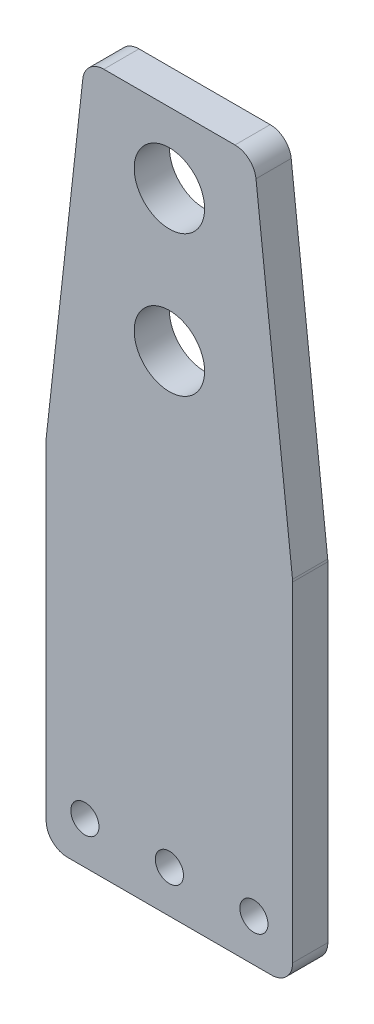
ISO-10303-21;
HEADER;
FILE_DESCRIPTION(('STEP AP214'),'2;1');
FILE_NAME('part.step','',(''),(''),'','','');
FILE_SCHEMA(('AUTOMOTIVE_DESIGN { 1 0 10303 214 1 1 1 1 }'));
ENDSEC;
DATA;
#1=APPLICATION_CONTEXT('core data for automotive mechanical design processes');
#2=APPLICATION_PROTOCOL_DEFINITION('international standard','automotive_design',2000,#1);
#3=PRODUCT_CONTEXT('',#1,'mechanical');
#4=PRODUCT('Part','Part','',(#3));
#5=PRODUCT_RELATED_PRODUCT_CATEGORY('part','',(#4));
#6=PRODUCT_DEFINITION_FORMATION('','',#4);
#7=PRODUCT_DEFINITION_CONTEXT('part definition',#1,'design');
#8=PRODUCT_DEFINITION('design','',#6,#7);
#9=PRODUCT_DEFINITION_SHAPE('','',#8);
#10=(LENGTH_UNIT() NAMED_UNIT(*) SI_UNIT(.MILLI.,.METRE.));
#11=(NAMED_UNIT(*) PLANE_ANGLE_UNIT() SI_UNIT($,.RADIAN.));
#12=(NAMED_UNIT(*) SI_UNIT($,.STERADIAN.) SOLID_ANGLE_UNIT());
#13=UNCERTAINTY_MEASURE_WITH_UNIT(LENGTH_MEASURE(1.E-05),#10,'distance_accuracy_value','');
#14=(GEOMETRIC_REPRESENTATION_CONTEXT(3) GLOBAL_UNCERTAINTY_ASSIGNED_CONTEXT((#13)) GLOBAL_UNIT_ASSIGNED_CONTEXT((#10,
#11,#12)) REPRESENTATION_CONTEXT('',''));
#15=CARTESIAN_POINT('',(0.,0.,0.));
#16=DIRECTION('',(0.,0.,1.));
#17=DIRECTION('',(1.,0.,0.));
#18=AXIS2_PLACEMENT_3D('',#15,#16,#17);
#19=CARTESIAN_POINT('',(-35.,50.,5.));
#20=DIRECTION('',(1.,0.,0.));
#21=DIRECTION('',(0.,0.,-1.));
#22=AXIS2_PLACEMENT_3D('',#19,#20,#21);
#23=PLANE('',#22);
#24=DIRECTION('',(0.,-1.,0.));
#25=VECTOR('',#24,1.);
#26=CARTESIAN_POINT('',(-35.,50.,0.));
#27=LINE('',#26,#25);
#28=CARTESIAN_POINT('',(-35.,49.8338445855878,0.));
#29=VERTEX_POINT('',#28);
#30=CARTESIAN_POINT('',(-35.,3.,0.));
#31=VERTEX_POINT('',#30);
#32=EDGE_CURVE('E171',#29,#31,#27,.T.);
#33=ORIENTED_EDGE('',*,*,#32,.T.);
#34=DIRECTION('',(0.,0.,-1.));
#35=VECTOR('',#34,1.);
#36=CARTESIAN_POINT('',(-35.,3.,5.));
#37=LINE('',#36,#35);
#38=CARTESIAN_POINT('',(-35.,3.,5.));
#39=VERTEX_POINT('',#38);
#40=EDGE_CURVE('E223',#31,#39,#37,.F.);
#41=ORIENTED_EDGE('',*,*,#40,.T.);
#42=DIRECTION('',(0.,-1.,0.));
#43=VECTOR('',#42,1.);
#44=CARTESIAN_POINT('',(-35.,50.,5.));
#45=LINE('',#44,#43);
#46=CARTESIAN_POINT('',(-35.,49.8338445855878,5.));
#47=VERTEX_POINT('',#46);
#48=EDGE_CURVE('E181',#47,#39,#45,.T.);
#49=ORIENTED_EDGE('',*,*,#48,.F.);
#50=DIRECTION('',(0.,0.,-1.));
#51=VECTOR('',#50,1.);
#52=CARTESIAN_POINT('',(-35.,49.8338445855878,5.));
#53=LINE('',#52,#51);
#54=EDGE_CURVE('E219',#47,#29,#53,.T.);
#55=ORIENTED_EDGE('',*,*,#54,.T.);
#56=EDGE_LOOP('',(#33,#41,#49,#55));
#57=FACE_BOUND('',#56,.T.);
#58=ADVANCED_FACE('F43',(#57),#23,.F.);
#59=CARTESIAN_POINT('',(-35.,0.,5.));
#60=DIRECTION('',(0.,1.,0.));
#61=DIRECTION('',(0.,0.,1.));
#62=AXIS2_PLACEMENT_3D('',#59,#60,#61);
#63=PLANE('',#62);
#64=DIRECTION('',(1.,0.,0.));
#65=VECTOR('',#64,1.);
#66=CARTESIAN_POINT('',(-35.,0.,0.));
#67=LINE('',#66,#65);
#68=CARTESIAN_POINT('',(-32.,0.,0.));
#69=VERTEX_POINT('',#68);
#70=CARTESIAN_POINT('',(-3.,0.,0.));
#71=VERTEX_POINT('',#70);
#72=EDGE_CURVE('E164',#69,#71,#67,.T.);
#73=ORIENTED_EDGE('',*,*,#72,.T.);
#74=DIRECTION('',(0.,0.,-1.));
#75=VECTOR('',#74,1.);
#76=CARTESIAN_POINT('',(-3.,0.,5.));
#77=LINE('',#76,#75);
#78=CARTESIAN_POINT('',(-3.,0.,5.));
#79=VERTEX_POINT('',#78);
#80=EDGE_CURVE('E138',#71,#79,#77,.F.);
#81=ORIENTED_EDGE('',*,*,#80,.T.);
#82=DIRECTION('',(1.,0.,0.));
#83=VECTOR('',#82,1.);
#84=CARTESIAN_POINT('',(-35.,0.,5.));
#85=LINE('',#84,#83);
#86=CARTESIAN_POINT('',(-32.,0.,5.));
#87=VERTEX_POINT('',#86);
#88=EDGE_CURVE('E258',#87,#79,#85,.T.);
#89=ORIENTED_EDGE('',*,*,#88,.F.);
#90=DIRECTION('',(0.,0.,-1.));
#91=VECTOR('',#90,1.);
#92=CARTESIAN_POINT('',(-32.,0.,5.));
#93=LINE('',#92,#91);
#94=EDGE_CURVE('E144',#87,#69,#93,.T.);
#95=ORIENTED_EDGE('',*,*,#94,.T.);
#96=EDGE_LOOP('',(#73,#81,#89,#95));
#97=FACE_BOUND('',#96,.T.);
#98=ADVANCED_FACE('F342',(#97),#63,.F.);
#99=CARTESIAN_POINT('',(0.,0.,5.));
#100=DIRECTION('',(-1.,0.,0.));
#101=DIRECTION('',(0.,0.,1.));
#102=AXIS2_PLACEMENT_3D('',#99,#100,#101);
#103=PLANE('',#102);
#104=DIRECTION('',(0.,1.,0.));
#105=VECTOR('',#104,1.);
#106=CARTESIAN_POINT('',(0.,0.,5.));
#107=LINE('',#106,#105);
#108=CARTESIAN_POINT('',(0.,3.,5.));
#109=VERTEX_POINT('',#108);
#110=CARTESIAN_POINT('',(0.,49.8338445855878,5.));
#111=VERTEX_POINT('',#110);
#112=EDGE_CURVE('E154',#109,#111,#107,.T.);
#113=ORIENTED_EDGE('',*,*,#112,.F.);
#114=DIRECTION('',(0.,0.,-1.));
#115=VECTOR('',#114,1.);
#116=CARTESIAN_POINT('',(0.,3.,5.));
#117=LINE('',#116,#115);
#118=CARTESIAN_POINT('',(0.,3.,0.));
#119=VERTEX_POINT('',#118);
#120=EDGE_CURVE('E137',#109,#119,#117,.T.);
#121=ORIENTED_EDGE('',*,*,#120,.T.);
#122=DIRECTION('',(0.,1.,0.));
#123=VECTOR('',#122,1.);
#124=CARTESIAN_POINT('',(0.,0.,0.));
#125=LINE('',#124,#123);
#126=CARTESIAN_POINT('',(0.,49.8338445855878,0.));
#127=VERTEX_POINT('',#126);
#128=EDGE_CURVE('E151',#119,#127,#125,.T.);
#129=ORIENTED_EDGE('',*,*,#128,.T.);
#130=DIRECTION('',(0.,0.,-1.));
#131=VECTOR('',#130,1.);
#132=CARTESIAN_POINT('',(0.,49.8338445855878,5.));
#133=LINE('',#132,#131);
#134=EDGE_CURVE('E157',#127,#111,#133,.F.);
#135=ORIENTED_EDGE('',*,*,#134,.T.);
#136=EDGE_LOOP('',(#113,#121,#129,#135));
#137=FACE_BOUND('',#136,.T.);
#138=ADVANCED_FACE('F150',(#137),#103,.F.);
#139=CARTESIAN_POINT('',(0.,50.,5.));
#140=DIRECTION('',(-0.993883734673619,-0.110431526074847,0.));
#141=DIRECTION('',(0.110431526074847,-0.993883734673619,0.));
#142=AXIS2_PLACEMENT_3D('',#139,#140,#141);
#143=PLANE('',#142);
#144=DIRECTION('',(-0.110431526074846,0.993883734673619,0.));
#145=VECTOR('',#144,1.);
#146=CARTESIAN_POINT('',(0.,50.,5.));
#147=LINE('',#146,#145);
#148=CARTESIAN_POINT('',(-0.0183487959791435,50.1651391638123,5.));
#149=VERTEX_POINT('',#148);
#150=CARTESIAN_POINT('',(-5.20347717535828,96.8312945782245,5.));
#151=VERTEX_POINT('',#150);
#152=EDGE_CURVE('E269',#149,#151,#147,.T.);
#153=ORIENTED_EDGE('',*,*,#152,.F.);
#154=DIRECTION('',(0.,0.,-1.));
#155=VECTOR('',#154,1.);
#156=CARTESIAN_POINT('',(-0.0183487959791435,50.1651391638123,5.));
#157=LINE('',#156,#155);
#158=CARTESIAN_POINT('',(-0.0183487959791435,50.1651391638123,0.));
#159=VERTEX_POINT('',#158);
#160=EDGE_CURVE('E229',#149,#159,#157,.T.);
#161=ORIENTED_EDGE('',*,*,#160,.T.);
#162=DIRECTION('',(-0.110431526074846,0.993883734673619,0.));
#163=VECTOR('',#162,1.);
#164=CARTESIAN_POINT('',(0.,50.,0.));
#165=LINE('',#164,#163);
#166=CARTESIAN_POINT('',(-5.20347717535828,96.8312945782245,0.));
#167=VERTEX_POINT('',#166);
#168=EDGE_CURVE('E163',#159,#167,#165,.T.);
#169=ORIENTED_EDGE('',*,*,#168,.T.);
#170=DIRECTION('',(0.,0.,-1.));
#171=VECTOR('',#170,1.);
#172=CARTESIAN_POINT('',(-5.20347717535828,96.8312945782245,5.));
#173=LINE('',#172,#171);
#174=EDGE_CURVE('E226',#167,#151,#173,.F.);
#175=ORIENTED_EDGE('',*,*,#174,.T.);
#176=EDGE_LOOP('',(#153,#161,#169,#175));
#177=FACE_BOUND('',#176,.T.);
#178=ADVANCED_FACE('F365',(#177),#143,.F.);
#179=CARTESIAN_POINT('',(-5.5,99.5,5.));
#180=DIRECTION('',(0.,-1.,0.));
#181=DIRECTION('',(0.,0.,-1.));
#182=AXIS2_PLACEMENT_3D('',#179,#180,#181);
#183=PLANE('',#182);
#184=DIRECTION('',(-1.,0.,0.));
#185=VECTOR('',#184,1.);
#186=CARTESIAN_POINT('',(-5.5,99.5,5.));
#187=LINE('',#186,#185);
#188=CARTESIAN_POINT('',(-8.18512837937914,99.5,5.));
#189=VERTEX_POINT('',#188);
#190=CARTESIAN_POINT('',(-26.8148716206209,99.5,5.));
#191=VERTEX_POINT('',#190);
#192=EDGE_CURVE('E273',#189,#191,#187,.T.);
#193=ORIENTED_EDGE('',*,*,#192,.F.);
#194=DIRECTION('',(0.,0.,-1.));
#195=VECTOR('',#194,1.);
#196=CARTESIAN_POINT('',(-8.18512837937914,99.5,5.));
#197=LINE('',#196,#195);
#198=CARTESIAN_POINT('',(-8.18512837937914,99.5,0.));
#199=VERTEX_POINT('',#198);
#200=EDGE_CURVE('E236',#189,#199,#197,.T.);
#201=ORIENTED_EDGE('',*,*,#200,.T.);
#202=DIRECTION('',(-1.,0.,0.));
#203=VECTOR('',#202,1.);
#204=CARTESIAN_POINT('',(-5.5,99.5,0.));
#205=LINE('',#204,#203);
#206=CARTESIAN_POINT('',(-26.8148716206209,99.5,0.));
#207=VERTEX_POINT('',#206);
#208=EDGE_CURVE('E169',#199,#207,#205,.T.);
#209=ORIENTED_EDGE('',*,*,#208,.T.);
#210=DIRECTION('',(0.,0.,-1.));
#211=VECTOR('',#210,1.);
#212=CARTESIAN_POINT('',(-26.8148716206209,99.5,5.));
#213=LINE('',#212,#211);
#214=EDGE_CURVE('E233',#207,#191,#213,.F.);
#215=ORIENTED_EDGE('',*,*,#214,.T.);
#216=EDGE_LOOP('',(#193,#201,#209,#215));
#217=FACE_BOUND('',#216,.T.);
#218=ADVANCED_FACE('F368',(#217),#183,.F.);
#219=CARTESIAN_POINT('',(-29.5,99.5,5.));
#220=DIRECTION('',(0.993883734673619,-0.110431526074847,0.));
#221=DIRECTION('',(0.110431526074847,0.993883734673619,0.));
#222=AXIS2_PLACEMENT_3D('',#219,#220,#221);
#223=PLANE('',#222);
#224=DIRECTION('',(-0.110431526074847,-0.993883734673619,0.));
#225=VECTOR('',#224,1.);
#226=CARTESIAN_POINT('',(-29.5,99.5,0.));
#227=LINE('',#226,#225);
#228=CARTESIAN_POINT('',(-29.7965228246417,96.8312945782245,0.));
#229=VERTEX_POINT('',#228);
#230=CARTESIAN_POINT('',(-34.9816512040209,50.1651391638123,0.));
#231=VERTEX_POINT('',#230);
#232=EDGE_CURVE('E178',#229,#231,#227,.T.);
#233=ORIENTED_EDGE('',*,*,#232,.T.);
#234=DIRECTION('',(0.,0.,-1.));
#235=VECTOR('',#234,1.);
#236=CARTESIAN_POINT('',(-34.9816512040209,50.1651391638123,5.));
#237=LINE('',#236,#235);
#238=CARTESIAN_POINT('',(-34.9816512040209,50.1651391638123,5.));
#239=VERTEX_POINT('',#238);
#240=EDGE_CURVE('E11',#231,#239,#237,.F.);
#241=ORIENTED_EDGE('',*,*,#240,.T.);
#242=DIRECTION('',(-0.110431526074847,-0.993883734673619,0.));
#243=VECTOR('',#242,1.);
#244=CARTESIAN_POINT('',(-29.5,99.5,5.));
#245=LINE('',#244,#243);
#246=CARTESIAN_POINT('',(-29.7965228246417,96.8312945782245,5.));
#247=VERTEX_POINT('',#246);
#248=EDGE_CURVE('E183',#247,#239,#245,.T.);
#249=ORIENTED_EDGE('',*,*,#248,.F.);
#250=DIRECTION('',(0.,0.,-1.));
#251=VECTOR('',#250,1.);
#252=CARTESIAN_POINT('',(-29.7965228246417,96.8312945782245,5.));
#253=LINE('',#252,#251);
#254=EDGE_CURVE('E52',#247,#229,#253,.T.);
#255=ORIENTED_EDGE('',*,*,#254,.T.);
#256=EDGE_LOOP('',(#233,#241,#249,#255));
#257=FACE_BOUND('',#256,.T.);
#258=ADVANCED_FACE('F243',(#257),#223,.F.);
#259=CARTESIAN_POINT('',(0.,0.,5.));
#260=DIRECTION('',(0.,0.,1.));
#261=DIRECTION('',(1.,0.,0.));
#262=AXIS2_PLACEMENT_3D('',#259,#260,#261);
#263=PLANE('',#262);
#264=CARTESIAN_POINT('',(-17.5,69.5,5.));
#265=DIRECTION('',(0.,0.,1.));
#266=DIRECTION('',(1.,0.,0.));
#267=AXIS2_PLACEMENT_3D('',#264,#265,#266);
#268=CIRCLE('',#267,4.99999999999999);
#269=CARTESIAN_POINT('',(-12.5,69.5,5.));
#270=VERTEX_POINT('',#269);
#271=EDGE_CURVE('E320',#270,#270,#268,.T.);
#272=ORIENTED_EDGE('',*,*,#271,.F.);
#273=EDGE_LOOP('',(#272));
#274=FACE_BOUND('',#273,.T.);
#275=CARTESIAN_POINT('',(-17.5,89.5,5.));
#276=DIRECTION('',(0.,0.,1.));
#277=DIRECTION('',(1.,0.,0.));
#278=AXIS2_PLACEMENT_3D('',#275,#276,#277);
#279=CIRCLE('',#278,4.99999999999999);
#280=CARTESIAN_POINT('',(-12.5,89.5,5.));
#281=VERTEX_POINT('',#280);
#282=EDGE_CURVE('E310',#281,#281,#279,.T.);
#283=ORIENTED_EDGE('',*,*,#282,.F.);
#284=EDGE_LOOP('',(#283));
#285=FACE_BOUND('',#284,.T.);
#286=CARTESIAN_POINT('',(-29.5,6.,5.));
#287=DIRECTION('',(0.,0.,1.));
#288=DIRECTION('',(1.,0.,0.));
#289=AXIS2_PLACEMENT_3D('',#286,#287,#288);
#290=CIRCLE('',#289,2.);
#291=CARTESIAN_POINT('',(-27.5,6.,5.));
#292=VERTEX_POINT('',#291);
#293=EDGE_CURVE('E281',#292,#292,#290,.T.);
#294=ORIENTED_EDGE('',*,*,#293,.F.);
#295=EDGE_LOOP('',(#294));
#296=FACE_BOUND('',#295,.T.);
#297=CARTESIAN_POINT('',(-17.5,6.,5.));
#298=DIRECTION('',(0.,0.,1.));
#299=DIRECTION('',(1.,0.,0.));
#300=AXIS2_PLACEMENT_3D('',#297,#298,#299);
#301=CIRCLE('',#300,2.);
#302=CARTESIAN_POINT('',(-15.5,6.,5.));
#303=VERTEX_POINT('',#302);
#304=EDGE_CURVE('E296',#303,#303,#301,.T.);
#305=ORIENTED_EDGE('',*,*,#304,.F.);
#306=EDGE_LOOP('',(#305));
#307=FACE_BOUND('',#306,.T.);
#308=CARTESIAN_POINT('',(-5.5,6.,5.));
#309=DIRECTION('',(0.,0.,1.));
#310=DIRECTION('',(1.,0.,0.));
#311=AXIS2_PLACEMENT_3D('',#308,#309,#310);
#312=CIRCLE('',#311,2.);
#313=CARTESIAN_POINT('',(-3.5,6.,5.));
#314=VERTEX_POINT('',#313);
#315=EDGE_CURVE('E264',#314,#314,#312,.T.);
#316=ORIENTED_EDGE('',*,*,#315,.F.);
#317=EDGE_LOOP('',(#316));
#318=FACE_BOUND('',#317,.T.);
#319=ORIENTED_EDGE('',*,*,#88,.T.);
#320=CARTESIAN_POINT('',(-3.,3.,5.));
#321=DIRECTION('',(0.,0.,1.));
#322=DIRECTION('',(1.,0.,0.));
#323=AXIS2_PLACEMENT_3D('',#320,#321,#322);
#324=CIRCLE('',#323,3.);
#325=EDGE_CURVE('E216',#79,#109,#324,.T.);
#326=ORIENTED_EDGE('',*,*,#325,.T.);
#327=ORIENTED_EDGE('',*,*,#112,.T.);
#328=CARTESIAN_POINT('',(-3.,49.8338445855878,5.));
#329=DIRECTION('',(0.,0.,1.));
#330=DIRECTION('',(1.,0.,0.));
#331=AXIS2_PLACEMENT_3D('',#328,#329,#330);
#332=CIRCLE('',#331,3.);
#333=EDGE_CURVE('E210',#111,#149,#332,.T.);
#334=ORIENTED_EDGE('',*,*,#333,.T.);
#335=ORIENTED_EDGE('',*,*,#152,.T.);
#336=CARTESIAN_POINT('',(-8.18512837937914,96.5,5.));
#337=DIRECTION('',(0.,0.,1.));
#338=DIRECTION('',(1.,0.,0.));
#339=AXIS2_PLACEMENT_3D('',#336,#337,#338);
#340=CIRCLE('',#339,3.);
#341=EDGE_CURVE('E207',#151,#189,#340,.T.);
#342=ORIENTED_EDGE('',*,*,#341,.T.);
#343=ORIENTED_EDGE('',*,*,#192,.T.);
#344=CARTESIAN_POINT('',(-26.8148716206209,96.5,5.));
#345=DIRECTION('',(0.,0.,1.));
#346=DIRECTION('',(1.,0.,0.));
#347=AXIS2_PLACEMENT_3D('',#344,#345,#346);
#348=CIRCLE('',#347,3.);
#349=EDGE_CURVE('E64',#191,#247,#348,.T.);
#350=ORIENTED_EDGE('',*,*,#349,.T.);
#351=ORIENTED_EDGE('',*,*,#248,.T.);
#352=CARTESIAN_POINT('',(-32.,49.8338445855878,5.));
#353=DIRECTION('',(0.,0.,1.));
#354=DIRECTION('',(1.,0.,0.));
#355=AXIS2_PLACEMENT_3D('',#352,#353,#354);
#356=CIRCLE('',#355,3.);
#357=EDGE_CURVE('E204',#239,#47,#356,.T.);
#358=ORIENTED_EDGE('',*,*,#357,.T.);
#359=ORIENTED_EDGE('',*,*,#48,.T.);
#360=CARTESIAN_POINT('',(-32.,3.,5.));
#361=DIRECTION('',(0.,0.,1.));
#362=DIRECTION('',(1.,0.,0.));
#363=AXIS2_PLACEMENT_3D('',#360,#361,#362);
#364=CIRCLE('',#363,3.);
#365=EDGE_CURVE('E213',#39,#87,#364,.T.);
#366=ORIENTED_EDGE('',*,*,#365,.T.);
#367=EDGE_LOOP('',(#319,#326,#327,#334,#335,#342,#343,#350,#351,#358,#359,#366));
#368=FACE_BOUND('',#367,.T.);
#369=ADVANCED_FACE('F330',(#274,#285,#296,#307,#318,#368),#263,.T.);
#370=CARTESIAN_POINT('',(0.,0.,0.));
#371=DIRECTION('',(0.,0.,1.));
#372=DIRECTION('',(1.,0.,0.));
#373=AXIS2_PLACEMENT_3D('',#370,#371,#372);
#374=PLANE('',#373);
#375=CARTESIAN_POINT('',(-17.5,69.5,0.));
#376=DIRECTION('',(0.,0.,1.));
#377=DIRECTION('',(1.,0.,0.));
#378=AXIS2_PLACEMENT_3D('',#375,#376,#377);
#379=CIRCLE('',#378,4.99999999999999);
#380=CARTESIAN_POINT('',(-12.5,69.5,0.));
#381=VERTEX_POINT('',#380);
#382=EDGE_CURVE('E315',#381,#381,#379,.T.);
#383=ORIENTED_EDGE('',*,*,#382,.T.);
#384=EDGE_LOOP('',(#383));
#385=FACE_BOUND('',#384,.T.);
#386=CARTESIAN_POINT('',(-17.5,89.5,0.));
#387=DIRECTION('',(0.,0.,1.));
#388=DIRECTION('',(1.,0.,0.));
#389=AXIS2_PLACEMENT_3D('',#386,#387,#388);
#390=CIRCLE('',#389,4.99999999999999);
#391=CARTESIAN_POINT('',(-12.5,89.5,0.));
#392=VERTEX_POINT('',#391);
#393=EDGE_CURVE('E290',#392,#392,#390,.T.);
#394=ORIENTED_EDGE('',*,*,#393,.T.);
#395=EDGE_LOOP('',(#394));
#396=FACE_BOUND('',#395,.T.);
#397=CARTESIAN_POINT('',(-29.5,6.,0.));
#398=DIRECTION('',(0.,0.,1.));
#399=DIRECTION('',(1.,0.,0.));
#400=AXIS2_PLACEMENT_3D('',#397,#398,#399);
#401=CIRCLE('',#400,2.);
#402=CARTESIAN_POINT('',(-27.5,6.,0.));
#403=VERTEX_POINT('',#402);
#404=EDGE_CURVE('E278',#403,#403,#401,.T.);
#405=ORIENTED_EDGE('',*,*,#404,.T.);
#406=EDGE_LOOP('',(#405));
#407=FACE_BOUND('',#406,.T.);
#408=CARTESIAN_POINT('',(-17.5,6.,0.));
#409=DIRECTION('',(0.,0.,1.));
#410=DIRECTION('',(1.,0.,0.));
#411=AXIS2_PLACEMENT_3D('',#408,#409,#410);
#412=CIRCLE('',#411,2.);
#413=CARTESIAN_POINT('',(-15.5,6.,0.));
#414=VERTEX_POINT('',#413);
#415=EDGE_CURVE('E287',#414,#414,#412,.T.);
#416=ORIENTED_EDGE('',*,*,#415,.T.);
#417=EDGE_LOOP('',(#416));
#418=FACE_BOUND('',#417,.T.);
#419=CARTESIAN_POINT('',(-5.5,6.,0.));
#420=DIRECTION('',(0.,0.,1.));
#421=DIRECTION('',(1.,0.,0.));
#422=AXIS2_PLACEMENT_3D('',#419,#420,#421);
#423=CIRCLE('',#422,2.);
#424=CARTESIAN_POINT('',(-3.5,6.,0.));
#425=VERTEX_POINT('',#424);
#426=EDGE_CURVE('E299',#425,#425,#423,.T.);
#427=ORIENTED_EDGE('',*,*,#426,.T.);
#428=EDGE_LOOP('',(#427));
#429=FACE_BOUND('',#428,.T.);
#430=ORIENTED_EDGE('',*,*,#128,.F.);
#431=CARTESIAN_POINT('',(-3.,3.,0.));
#432=DIRECTION('',(0.,0.,1.));
#433=DIRECTION('',(1.,0.,0.));
#434=AXIS2_PLACEMENT_3D('',#431,#432,#433);
#435=CIRCLE('',#434,3.);
#436=EDGE_CURVE('E133',#119,#71,#435,.F.);
#437=ORIENTED_EDGE('',*,*,#436,.T.);
#438=ORIENTED_EDGE('',*,*,#72,.F.);
#439=CARTESIAN_POINT('',(-32.,3.,0.));
#440=DIRECTION('',(0.,0.,1.));
#441=DIRECTION('',(1.,0.,0.));
#442=AXIS2_PLACEMENT_3D('',#439,#440,#441);
#443=CIRCLE('',#442,3.);
#444=EDGE_CURVE('E145',#69,#31,#443,.F.);
#445=ORIENTED_EDGE('',*,*,#444,.T.);
#446=ORIENTED_EDGE('',*,*,#32,.F.);
#447=CARTESIAN_POINT('',(-32.,49.8338445855878,0.));
#448=DIRECTION('',(0.,0.,1.));
#449=DIRECTION('',(1.,0.,0.));
#450=AXIS2_PLACEMENT_3D('',#447,#448,#449);
#451=CIRCLE('',#450,3.);
#452=EDGE_CURVE('E187',#29,#231,#451,.F.);
#453=ORIENTED_EDGE('',*,*,#452,.T.);
#454=ORIENTED_EDGE('',*,*,#232,.F.);
#455=CARTESIAN_POINT('',(-26.8148716206209,96.5,0.));
#456=DIRECTION('',(0.,0.,1.));
#457=DIRECTION('',(1.,0.,0.));
#458=AXIS2_PLACEMENT_3D('',#455,#456,#457);
#459=CIRCLE('',#458,3.);
#460=EDGE_CURVE('E156',#229,#207,#459,.F.);
#461=ORIENTED_EDGE('',*,*,#460,.T.);
#462=ORIENTED_EDGE('',*,*,#208,.F.);
#463=CARTESIAN_POINT('',(-8.18512837937914,96.5,0.));
#464=DIRECTION('',(0.,0.,1.));
#465=DIRECTION('',(1.,0.,0.));
#466=AXIS2_PLACEMENT_3D('',#463,#464,#465);
#467=CIRCLE('',#466,3.);
#468=EDGE_CURVE('E190',#199,#167,#467,.F.);
#469=ORIENTED_EDGE('',*,*,#468,.T.);
#470=ORIENTED_EDGE('',*,*,#168,.F.);
#471=CARTESIAN_POINT('',(-3.,49.8338445855878,0.));
#472=DIRECTION('',(0.,0.,1.));
#473=DIRECTION('',(1.,0.,0.));
#474=AXIS2_PLACEMENT_3D('',#471,#472,#473);
#475=CIRCLE('',#474,3.);
#476=EDGE_CURVE('E161',#159,#127,#475,.F.);
#477=ORIENTED_EDGE('',*,*,#476,.T.);
#478=EDGE_LOOP('',(#430,#437,#438,#445,#446,#453,#454,#461,#462,#469,#470,#477));
#479=FACE_BOUND('',#478,.T.);
#480=ADVANCED_FACE('F159',(#385,#396,#407,#418,#429,#479),#374,.F.);
#481=CARTESIAN_POINT('',(-3.,3.,5.));
#482=DIRECTION('',(0.,0.,-1.));
#483=DIRECTION('',(-1.,0.,0.));
#484=AXIS2_PLACEMENT_3D('',#481,#482,#483);
#485=CYLINDRICAL_SURFACE('',#484,3.);
#486=ORIENTED_EDGE('',*,*,#325,.F.);
#487=ORIENTED_EDGE('',*,*,#80,.F.);
#488=ORIENTED_EDGE('',*,*,#436,.F.);
#489=ORIENTED_EDGE('',*,*,#120,.F.);
#490=EDGE_LOOP('',(#486,#487,#488,#489));
#491=FACE_BOUND('',#490,.T.);
#492=ADVANCED_FACE('F136',(#491),#485,.T.);
#493=CARTESIAN_POINT('',(-32.,3.,5.));
#494=DIRECTION('',(0.,0.,-1.));
#495=DIRECTION('',(-1.,0.,0.));
#496=AXIS2_PLACEMENT_3D('',#493,#494,#495);
#497=CYLINDRICAL_SURFACE('',#496,3.);
#498=ORIENTED_EDGE('',*,*,#365,.F.);
#499=ORIENTED_EDGE('',*,*,#40,.F.);
#500=ORIENTED_EDGE('',*,*,#444,.F.);
#501=ORIENTED_EDGE('',*,*,#94,.F.);
#502=EDGE_LOOP('',(#498,#499,#500,#501));
#503=FACE_BOUND('',#502,.T.);
#504=ADVANCED_FACE('F344',(#503),#497,.T.);
#505=CARTESIAN_POINT('',(-3.,49.8338445855878,5.));
#506=DIRECTION('',(0.,0.,-1.));
#507=DIRECTION('',(-1.,0.,0.));
#508=AXIS2_PLACEMENT_3D('',#505,#506,#507);
#509=CYLINDRICAL_SURFACE('',#508,3.);
#510=ORIENTED_EDGE('',*,*,#333,.F.);
#511=ORIENTED_EDGE('',*,*,#134,.F.);
#512=ORIENTED_EDGE('',*,*,#476,.F.);
#513=ORIENTED_EDGE('',*,*,#160,.F.);
#514=EDGE_LOOP('',(#510,#511,#512,#513));
#515=FACE_BOUND('',#514,.T.);
#516=ADVANCED_FACE('F346',(#515),#509,.T.);
#517=CARTESIAN_POINT('',(-8.18512837937914,96.5,5.));
#518=DIRECTION('',(0.,0.,-1.));
#519=DIRECTION('',(-1.,0.,0.));
#520=AXIS2_PLACEMENT_3D('',#517,#518,#519);
#521=CYLINDRICAL_SURFACE('',#520,3.);
#522=ORIENTED_EDGE('',*,*,#341,.F.);
#523=ORIENTED_EDGE('',*,*,#174,.F.);
#524=ORIENTED_EDGE('',*,*,#468,.F.);
#525=ORIENTED_EDGE('',*,*,#200,.F.);
#526=EDGE_LOOP('',(#522,#523,#524,#525));
#527=FACE_BOUND('',#526,.T.);
#528=ADVANCED_FACE('F352',(#527),#521,.T.);
#529=CARTESIAN_POINT('',(-32.,49.8338445855878,5.));
#530=DIRECTION('',(0.,0.,-1.));
#531=DIRECTION('',(-1.,0.,0.));
#532=AXIS2_PLACEMENT_3D('',#529,#530,#531);
#533=CYLINDRICAL_SURFACE('',#532,3.);
#534=ORIENTED_EDGE('',*,*,#357,.F.);
#535=ORIENTED_EDGE('',*,*,#240,.F.);
#536=ORIENTED_EDGE('',*,*,#452,.F.);
#537=ORIENTED_EDGE('',*,*,#54,.F.);
#538=EDGE_LOOP('',(#534,#535,#536,#537));
#539=FACE_BOUND('',#538,.T.);
#540=ADVANCED_FACE('F251',(#539),#533,.T.);
#541=CARTESIAN_POINT('',(-26.8148716206209,96.5,5.));
#542=DIRECTION('',(0.,0.,-1.));
#543=DIRECTION('',(-1.,0.,0.));
#544=AXIS2_PLACEMENT_3D('',#541,#542,#543);
#545=CYLINDRICAL_SURFACE('',#544,3.);
#546=ORIENTED_EDGE('',*,*,#349,.F.);
#547=ORIENTED_EDGE('',*,*,#214,.F.);
#548=ORIENTED_EDGE('',*,*,#460,.F.);
#549=ORIENTED_EDGE('',*,*,#254,.F.);
#550=EDGE_LOOP('',(#546,#547,#548,#549));
#551=FACE_BOUND('',#550,.T.);
#552=ADVANCED_FACE('F45',(#551),#545,.T.);
#553=CARTESIAN_POINT('',(-5.5,6.,0.));
#554=DIRECTION('',(0.,0.,1.));
#555=DIRECTION('',(1.,0.,0.));
#556=AXIS2_PLACEMENT_3D('',#553,#554,#555);
#557=CYLINDRICAL_SURFACE('',#556,2.);
#558=ORIENTED_EDGE('',*,*,#426,.F.);
#559=EDGE_LOOP('',(#558));
#560=FACE_BOUND('',#559,.T.);
#561=ORIENTED_EDGE('',*,*,#315,.T.);
#562=EDGE_LOOP('',(#561));
#563=FACE_BOUND('',#562,.T.);
#564=ADVANCED_FACE('F378',(#560,#563),#557,.F.);
#565=CARTESIAN_POINT('',(-17.5,6.,0.));
#566=DIRECTION('',(0.,0.,1.));
#567=DIRECTION('',(1.,0.,0.));
#568=AXIS2_PLACEMENT_3D('',#565,#566,#567);
#569=CYLINDRICAL_SURFACE('',#568,2.);
#570=ORIENTED_EDGE('',*,*,#415,.F.);
#571=EDGE_LOOP('',(#570));
#572=FACE_BOUND('',#571,.T.);
#573=ORIENTED_EDGE('',*,*,#304,.T.);
#574=EDGE_LOOP('',(#573));
#575=FACE_BOUND('',#574,.T.);
#576=ADVANCED_FACE('F381',(#572,#575),#569,.F.);
#577=CARTESIAN_POINT('',(-29.5,6.,0.));
#578=DIRECTION('',(0.,0.,1.));
#579=DIRECTION('',(1.,0.,0.));
#580=AXIS2_PLACEMENT_3D('',#577,#578,#579);
#581=CYLINDRICAL_SURFACE('',#580,2.);
#582=ORIENTED_EDGE('',*,*,#404,.F.);
#583=EDGE_LOOP('',(#582));
#584=FACE_BOUND('',#583,.T.);
#585=ORIENTED_EDGE('',*,*,#293,.T.);
#586=EDGE_LOOP('',(#585));
#587=FACE_BOUND('',#586,.T.);
#588=ADVANCED_FACE('F385',(#584,#587),#581,.F.);
#589=CARTESIAN_POINT('',(-17.5,89.5,5.));
#590=DIRECTION('',(0.,0.,1.));
#591=DIRECTION('',(1.,0.,0.));
#592=AXIS2_PLACEMENT_3D('',#589,#590,#591);
#593=CYLINDRICAL_SURFACE('',#592,4.99999999999999);
#594=ORIENTED_EDGE('',*,*,#282,.T.);
#595=EDGE_LOOP('',(#594));
#596=FACE_BOUND('',#595,.T.);
#597=ORIENTED_EDGE('',*,*,#393,.F.);
#598=EDGE_LOOP('',(#597));
#599=FACE_BOUND('',#598,.T.);
#600=ADVANCED_FACE('F389',(#596,#599),#593,.F.);
#601=CARTESIAN_POINT('',(-17.5,69.5,5.));
#602=DIRECTION('',(0.,0.,1.));
#603=DIRECTION('',(1.,0.,0.));
#604=AXIS2_PLACEMENT_3D('',#601,#602,#603);
#605=CYLINDRICAL_SURFACE('',#604,4.99999999999999);
#606=ORIENTED_EDGE('',*,*,#271,.T.);
#607=EDGE_LOOP('',(#606));
#608=FACE_BOUND('',#607,.T.);
#609=ORIENTED_EDGE('',*,*,#382,.F.);
#610=EDGE_LOOP('',(#609));
#611=FACE_BOUND('',#610,.T.);
#612=ADVANCED_FACE('F327',(#608,#611),#605,.F.);
#613=CLOSED_SHELL('',(#58,#98,#138,#178,#218,#258,#369,#480,#492,#504,#516,#528,#540,#552,#564,
#576,#588,#600,#612));
#614=MANIFOLD_SOLID_BREP('B2',#613);
#615=ADVANCED_BREP_SHAPE_REPRESENTATION('',(#18,#614),#14);
#616=SHAPE_DEFINITION_REPRESENTATION(#9,#615);
ENDSEC;
END-ISO-10303-21;
